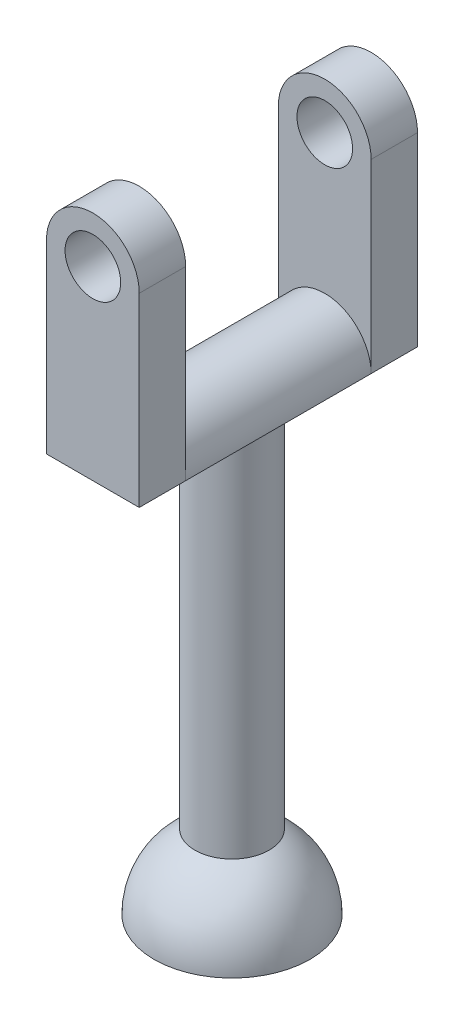
ISO-10303-21;
HEADER;
FILE_DESCRIPTION(('STEP AP214'),'2;1');
FILE_NAME('part.step','',(''),(''),'','','');
FILE_SCHEMA(('AUTOMOTIVE_DESIGN { 1 0 10303 214 1 1 1 1 }'));
ENDSEC;
DATA;
#1=APPLICATION_CONTEXT('core data for automotive mechanical design processes');
#2=APPLICATION_PROTOCOL_DEFINITION('international standard','automotive_design',2000,#1);
#3=PRODUCT_CONTEXT('',#1,'mechanical');
#4=PRODUCT('Part','Part','',(#3));
#5=PRODUCT_RELATED_PRODUCT_CATEGORY('part','',(#4));
#6=PRODUCT_DEFINITION_FORMATION('','',#4);
#7=PRODUCT_DEFINITION_CONTEXT('part definition',#1,'design');
#8=PRODUCT_DEFINITION('design','',#6,#7);
#9=PRODUCT_DEFINITION_SHAPE('','',#8);
#10=(LENGTH_UNIT() NAMED_UNIT(*) SI_UNIT(.MILLI.,.METRE.));
#11=(NAMED_UNIT(*) PLANE_ANGLE_UNIT() SI_UNIT($,.RADIAN.));
#12=(NAMED_UNIT(*) SI_UNIT($,.STERADIAN.) SOLID_ANGLE_UNIT());
#13=UNCERTAINTY_MEASURE_WITH_UNIT(LENGTH_MEASURE(1.E-05),#10,'distance_accuracy_value','');
#14=(GEOMETRIC_REPRESENTATION_CONTEXT(3) GLOBAL_UNCERTAINTY_ASSIGNED_CONTEXT((#13)) GLOBAL_UNIT_ASSIGNED_CONTEXT((#10,
#11,#12)) REPRESENTATION_CONTEXT('',''));
#15=CARTESIAN_POINT('',(0.,0.,0.));
#16=DIRECTION('',(0.,0.,1.));
#17=DIRECTION('',(1.,0.,0.));
#18=AXIS2_PLACEMENT_3D('',#15,#16,#17);
#19=CARTESIAN_POINT('',(6.34999999999999,50.8,19.05));
#20=DIRECTION('',(-1.,0.,0.));
#21=DIRECTION('',(0.,-1.,0.));
#22=AXIS2_PLACEMENT_3D('',#19,#20,#21);
#23=PLANE('',#22);
#24=DIRECTION('',(0.,1.,0.));
#25=VECTOR('',#24,1.);
#26=CARTESIAN_POINT('',(6.34999999999999,50.8,19.05));
#27=LINE('',#26,#25);
#28=CARTESIAN_POINT('',(6.35,19.05,19.05));
#29=VERTEX_POINT('',#28);
#30=CARTESIAN_POINT('',(6.34999999999999,44.45,19.05));
#31=VERTEX_POINT('',#30);
#32=EDGE_CURVE('E155',#29,#31,#27,.T.);
#33=ORIENTED_EDGE('',*,*,#32,.F.);
#34=DIRECTION('',(0.,0.,1.));
#35=VECTOR('',#34,1.);
#36=CARTESIAN_POINT('',(6.35,19.05,19.05));
#37=LINE('',#36,#35);
#38=CARTESIAN_POINT('',(6.35,19.05,12.7));
#39=VERTEX_POINT('',#38);
#40=EDGE_CURVE('E118',#39,#29,#37,.T.);
#41=ORIENTED_EDGE('',*,*,#40,.F.);
#42=DIRECTION('',(0.,1.,0.));
#43=VECTOR('',#42,1.);
#44=CARTESIAN_POINT('',(6.35000000000001,25.4,12.7));
#45=LINE('',#44,#43);
#46=CARTESIAN_POINT('',(6.35000000000001,44.45,12.7));
#47=VERTEX_POINT('',#46);
#48=EDGE_CURVE('E137',#39,#47,#45,.T.);
#49=ORIENTED_EDGE('',*,*,#48,.T.);
#50=DIRECTION('',(0.,0.,-1.));
#51=VECTOR('',#50,1.);
#52=CARTESIAN_POINT('',(6.34999999999999,44.45,19.05));
#53=LINE('',#52,#51);
#54=EDGE_CURVE('E168',#47,#31,#53,.F.);
#55=ORIENTED_EDGE('',*,*,#54,.T.);
#56=EDGE_LOOP('',(#33,#41,#49,#55));
#57=FACE_BOUND('',#56,.T.);
#58=ADVANCED_FACE('F36',(#57),#23,.F.);
#59=CARTESIAN_POINT('',(-6.35000000000001,50.8,19.05));
#60=DIRECTION('',(1.,0.,0.));
#61=DIRECTION('',(0.,1.,0.));
#62=AXIS2_PLACEMENT_3D('',#59,#60,#61);
#63=PLANE('',#62);
#64=DIRECTION('',(0.,-1.,0.));
#65=VECTOR('',#64,1.);
#66=CARTESIAN_POINT('',(-6.35000000000001,50.8,-19.05));
#67=LINE('',#66,#65);
#68=CARTESIAN_POINT('',(-6.35000000000001,44.45,-19.05));
#69=VERTEX_POINT('',#68);
#70=CARTESIAN_POINT('',(-6.35,19.05,-19.05));
#71=VERTEX_POINT('',#70);
#72=EDGE_CURVE('E158',#69,#71,#67,.T.);
#73=ORIENTED_EDGE('',*,*,#72,.T.);
#74=DIRECTION('',(0.,0.,1.));
#75=VECTOR('',#74,1.);
#76=CARTESIAN_POINT('',(-6.35000000000002,19.05,19.05));
#77=LINE('',#76,#75);
#78=CARTESIAN_POINT('',(-6.35000000000002,19.05,-12.7));
#79=VERTEX_POINT('',#78);
#80=EDGE_CURVE('E52',#71,#79,#77,.T.);
#81=ORIENTED_EDGE('',*,*,#80,.T.);
#82=DIRECTION('',(0.,-1.,0.));
#83=VECTOR('',#82,1.);
#84=CARTESIAN_POINT('',(-6.35000000000001,50.8,-12.7));
#85=LINE('',#84,#83);
#86=CARTESIAN_POINT('',(-6.35000000000001,44.45,-12.7));
#87=VERTEX_POINT('',#86);
#88=EDGE_CURVE('E133',#87,#79,#85,.T.);
#89=ORIENTED_EDGE('',*,*,#88,.F.);
#90=DIRECTION('',(0.,0.,-1.));
#91=VECTOR('',#90,1.);
#92=CARTESIAN_POINT('',(-6.35000000000001,44.45,19.05));
#93=LINE('',#92,#91);
#94=EDGE_CURVE('E161',#87,#69,#93,.T.);
#95=ORIENTED_EDGE('',*,*,#94,.T.);
#96=EDGE_LOOP('',(#73,#81,#89,#95));
#97=FACE_BOUND('',#96,.T.);
#98=ADVANCED_FACE('F233',(#97),#63,.F.);
#99=CARTESIAN_POINT('',(0.,19.05,19.05));
#100=DIRECTION('',(0.,0.,1.));
#101=DIRECTION('',(1.,0.,0.));
#102=AXIS2_PLACEMENT_3D('',#99,#100,#101);
#103=CYLINDRICAL_SURFACE('',#102,6.35);
#104=DIRECTION('',(0.,0.,1.));
#105=VECTOR('',#104,1.);
#106=CARTESIAN_POINT('',(-6.35,19.05,19.05));
#107=LINE('',#106,#105);
#108=CARTESIAN_POINT('',(-6.35000000000002,19.05,12.7));
#109=VERTEX_POINT('',#108);
#110=EDGE_CURVE('E177',#109,#79,#107,.F.);
#111=ORIENTED_EDGE('',*,*,#110,.F.);
#112=CARTESIAN_POINT('',(0.,19.05,12.7));
#113=DIRECTION('',(0.,0.,1.));
#114=DIRECTION('',(0.,-1.,0.));
#115=AXIS2_PLACEMENT_3D('',#112,#113,#114);
#116=CIRCLE('',#115,6.35);
#117=EDGE_CURVE('E188',#39,#109,#116,.T.);
#118=ORIENTED_EDGE('',*,*,#117,.F.);
#119=DIRECTION('',(0.,0.,1.));
#120=VECTOR('',#119,1.);
#121=CARTESIAN_POINT('',(6.35,19.05,19.05));
#122=LINE('',#121,#120);
#123=CARTESIAN_POINT('',(6.35,19.05,-12.7));
#124=VERTEX_POINT('',#123);
#125=EDGE_CURVE('E183',#124,#39,#122,.T.);
#126=ORIENTED_EDGE('',*,*,#125,.F.);
#127=CARTESIAN_POINT('',(0.,19.05,-12.7));
#128=DIRECTION('',(0.,0.,-1.));
#129=DIRECTION('',(-1.,0.,0.));
#130=AXIS2_PLACEMENT_3D('',#127,#128,#129);
#131=CIRCLE('',#130,6.35);
#132=EDGE_CURVE('E185',#79,#124,#131,.T.);
#133=ORIENTED_EDGE('',*,*,#132,.F.);
#134=EDGE_LOOP('',(#111,#118,#126,#133));
#135=FACE_BOUND('',#134,.T.);
#136=ADVANCED_FACE('F39',(#135),#103,.T.);
#137=CARTESIAN_POINT('',(0.,44.45,19.05));
#138=DIRECTION('',(0.,0.,-1.));
#139=DIRECTION('',(-1.,0.,0.));
#140=AXIS2_PLACEMENT_3D('',#137,#138,#139);
#141=CYLINDRICAL_SURFACE('',#140,6.35);
#142=CARTESIAN_POINT('',(0.,44.45,12.7));
#143=DIRECTION('',(0.,0.,1.));
#144=DIRECTION('',(0.,-1.,0.));
#145=AXIS2_PLACEMENT_3D('',#142,#143,#144);
#146=CIRCLE('',#145,6.35);
#147=CARTESIAN_POINT('',(-6.35000000000001,44.45,12.7));
#148=VERTEX_POINT('',#147);
#149=EDGE_CURVE('E146',#148,#47,#146,.F.);
#150=ORIENTED_EDGE('',*,*,#149,.F.);
#151=CARTESIAN_POINT('',(-6.35000000000001,44.45,19.05));
#152=VERTEX_POINT('',#151);
#153=EDGE_CURVE('E165',#152,#148,#93,.T.);
#154=ORIENTED_EDGE('',*,*,#153,.F.);
#155=CARTESIAN_POINT('',(0.,44.45,19.05));
#156=DIRECTION('',(0.,0.,1.));
#157=DIRECTION('',(1.,0.,0.));
#158=AXIS2_PLACEMENT_3D('',#155,#156,#157);
#159=CIRCLE('',#158,6.35);
#160=EDGE_CURVE('E172',#31,#152,#159,.T.);
#161=ORIENTED_EDGE('',*,*,#160,.F.);
#162=ORIENTED_EDGE('',*,*,#54,.F.);
#163=EDGE_LOOP('',(#150,#154,#161,#162));
#164=FACE_BOUND('',#163,.T.);
#165=ADVANCED_FACE('F223',(#164),#141,.T.);
#166=CARTESIAN_POINT('',(0.,44.45,-19.05));
#167=DIRECTION('',(0.,0.,1.));
#168=DIRECTION('',(1.,0.,0.));
#169=AXIS2_PLACEMENT_3D('',#166,#167,#168);
#170=CYLINDRICAL_SURFACE('',#169,3.81);
#171=CARTESIAN_POINT('',(0.,44.45,12.7));
#172=DIRECTION('',(0.,0.,1.));
#173=DIRECTION('',(0.,-1.,0.));
#174=AXIS2_PLACEMENT_3D('',#171,#172,#173);
#175=CIRCLE('',#174,3.81);
#176=CARTESIAN_POINT('',(3.81,44.45,12.7));
#177=VERTEX_POINT('',#176);
#178=EDGE_CURVE('E145',#177,#177,#175,.T.);
#179=CARTESIAN_POINT('',(0.,44.45,19.05));
#180=DIRECTION('',(0.,0.,-1.));
#181=DIRECTION('',(1.,0.,0.));
#182=AXIS2_PLACEMENT_3D('',#179,#180,#181);
#183=CIRCLE('',#182,3.81);
#184=CARTESIAN_POINT('',(3.81,44.45,19.05));
#185=VERTEX_POINT('',#184);
#186=EDGE_CURVE('E148',#185,#185,#183,.T.);
#187=CARTESIAN_POINT('',(3.81,44.45,12.7));
#188=CARTESIAN_POINT('',(3.81,44.45,12.7661458333333));
#189=CARTESIAN_POINT('',(3.81,44.45,12.8322916666667));
#190=CARTESIAN_POINT('',(3.81,44.45,12.9645833333333));
#191=CARTESIAN_POINT('',(3.81,44.45,13.0307291666667));
#192=CARTESIAN_POINT('',(3.81,44.45,13.1630208333333));
#193=CARTESIAN_POINT('',(3.81,44.45,13.2291666666667));
#194=CARTESIAN_POINT('',(3.81,44.45,13.3614583333333));
#195=CARTESIAN_POINT('',(3.81,44.45,13.4276041666667));
#196=CARTESIAN_POINT('',(3.81,44.45,13.5598958333333));
#197=CARTESIAN_POINT('',(3.81,44.45,13.6260416666667));
#198=CARTESIAN_POINT('',(3.81,44.45,13.7583333333333));
#199=CARTESIAN_POINT('',(3.81,44.45,13.8244791666667));
#200=CARTESIAN_POINT('',(3.81,44.45,13.9567708333333));
#201=CARTESIAN_POINT('',(3.81,44.45,14.0229166666667));
#202=CARTESIAN_POINT('',(3.81,44.45,14.1552083333333));
#203=CARTESIAN_POINT('',(3.81,44.45,14.2213541666667));
#204=CARTESIAN_POINT('',(3.81,44.45,14.3536458333333));
#205=CARTESIAN_POINT('',(3.81,44.45,14.4197916666667));
#206=CARTESIAN_POINT('',(3.81,44.45,14.5520833333333));
#207=CARTESIAN_POINT('',(3.81,44.45,14.6182291666667));
#208=CARTESIAN_POINT('',(3.81,44.45,14.7505208333333));
#209=CARTESIAN_POINT('',(3.81,44.45,14.8166666666667));
#210=CARTESIAN_POINT('',(3.81,44.45,14.9489583333333));
#211=CARTESIAN_POINT('',(3.81,44.45,15.0151041666667));
#212=CARTESIAN_POINT('',(3.81,44.45,15.1473958333333));
#213=CARTESIAN_POINT('',(3.81,44.45,15.2135416666667));
#214=CARTESIAN_POINT('',(3.81,44.45,15.3458333333333));
#215=CARTESIAN_POINT('',(3.81,44.45,15.4119791666667));
#216=CARTESIAN_POINT('',(3.81,44.45,15.5442708333333));
#217=CARTESIAN_POINT('',(3.81,44.45,15.6104166666667));
#218=CARTESIAN_POINT('',(3.81,44.45,15.7427083333333));
#219=CARTESIAN_POINT('',(3.81,44.45,15.8088541666667));
#220=CARTESIAN_POINT('',(3.81,44.45,15.9411458333333));
#221=CARTESIAN_POINT('',(3.81,44.45,16.0072916666667));
#222=CARTESIAN_POINT('',(3.81,44.45,16.1395833333333));
#223=CARTESIAN_POINT('',(3.81,44.45,16.2057291666667));
#224=CARTESIAN_POINT('',(3.81,44.45,16.3380208333333));
#225=CARTESIAN_POINT('',(3.81,44.45,16.4041666666667));
#226=CARTESIAN_POINT('',(3.81,44.45,16.5364583333333));
#227=CARTESIAN_POINT('',(3.81,44.45,16.6026041666667));
#228=CARTESIAN_POINT('',(3.81,44.45,16.7348958333333));
#229=CARTESIAN_POINT('',(3.81,44.45,16.8010416666667));
#230=CARTESIAN_POINT('',(3.81,44.45,16.9333333333333));
#231=CARTESIAN_POINT('',(3.81,44.45,16.9994791666667));
#232=CARTESIAN_POINT('',(3.81,44.45,17.1317708333333));
#233=CARTESIAN_POINT('',(3.81,44.45,17.1979166666667));
#234=CARTESIAN_POINT('',(3.81,44.45,17.3302083333333));
#235=CARTESIAN_POINT('',(3.81,44.45,17.3963541666667));
#236=CARTESIAN_POINT('',(3.81,44.45,17.5286458333333));
#237=CARTESIAN_POINT('',(3.81,44.45,17.5947916666667));
#238=CARTESIAN_POINT('',(3.81,44.45,17.7270833333333));
#239=CARTESIAN_POINT('',(3.81,44.45,17.7932291666667));
#240=CARTESIAN_POINT('',(3.81,44.45,17.9255208333333));
#241=CARTESIAN_POINT('',(3.81,44.45,17.9916666666667));
#242=CARTESIAN_POINT('',(3.81,44.45,18.1239583333333));
#243=CARTESIAN_POINT('',(3.81,44.45,18.1901041666667));
#244=CARTESIAN_POINT('',(3.81,44.45,18.3223958333333));
#245=CARTESIAN_POINT('',(3.81,44.45,18.3885416666667));
#246=CARTESIAN_POINT('',(3.81,44.45,18.5208333333333));
#247=CARTESIAN_POINT('',(3.81,44.45,18.5869791666667));
#248=CARTESIAN_POINT('',(3.81,44.45,18.7192708333333));
#249=CARTESIAN_POINT('',(3.81,44.45,18.7854166666667));
#250=CARTESIAN_POINT('',(3.81,44.45,18.9177083333333));
#251=CARTESIAN_POINT('',(3.81,44.45,18.9838541666667));
#252=CARTESIAN_POINT('',(3.81,44.45,19.05));
#253=B_SPLINE_CURVE_WITH_KNOTS('',3,(#187,#188,#189,#190,#191,#192,#193,#194,#195,#196,#197,
#198,#199,#200,#201,#202,#203,#204,#205,#206,#207,#208,#209,#210,#211,#212,#213,#214,#215,#216,
#217,#218,#219,#220,#221,#222,#223,#224,#225,#226,#227,#228,#229,#230,#231,#232,#233,#234,#235,
#236,#237,#238,#239,#240,#241,#242,#243,#244,#245,#246,#247,#248,#249,#250,#251,#252),
.UNSPECIFIED.,.F.,.F.,(4,2,2,2,2,2,2,2,2,2,2,2,2,2,2,2,2,2,2,2,2,2,2,2,2,2,2,2,2,2,2,2,4),(0.,
0.198437500000002,0.396874999999998,0.5953125,0.793750000000003,0.992187499999998,1.190625,
1.3890625,1.58750000000001,1.7859375,1.984375,2.18281250000001,2.38125,2.5796875,
2.77812500000001,2.9765625,3.175,3.37343750000001,3.571875,3.7703125,3.96875000000001,4.1671875,
4.365625,4.56406250000001,4.7625,4.96093750000001,5.15937500000001,5.3578125,5.55625000000001,
5.75468750000001,5.95312500000001,6.15156250000001,6.35000000000001),.UNSPECIFIED.);
#254=EDGE_CURVE('BSEAM252',#177,#185,#253,.T.);
#255=ORIENTED_EDGE('',*,*,#178,.F.);
#256=ORIENTED_EDGE('',*,*,#186,.F.);
#257=ORIENTED_EDGE('',*,*,#254,.T.);
#258=ORIENTED_EDGE('',*,*,#254,.F.);
#259=EDGE_LOOP('',(#255,#257,#256,#258));
#260=FACE_BOUND('',#259,.T.);
#261=ADVANCED_FACE('F252',(#260),#170,.F.);
#262=CARTESIAN_POINT('',(0.,44.45,-12.7));
#263=DIRECTION('',(0.,0.,-1.));
#264=DIRECTION('',(-1.,0.,0.));
#265=AXIS2_PLACEMENT_3D('',#262,#263,#264);
#266=CIRCLE('',#265,6.35);
#267=CARTESIAN_POINT('',(6.35000000000001,44.45,-12.7));
#268=VERTEX_POINT('',#267);
#269=EDGE_CURVE('E60',#268,#87,#266,.F.);
#270=ORIENTED_EDGE('',*,*,#269,.F.);
#271=CARTESIAN_POINT('',(6.34999999999999,44.45,-19.05));
#272=VERTEX_POINT('',#271);
#273=EDGE_CURVE('E169',#272,#268,#53,.F.);
#274=ORIENTED_EDGE('',*,*,#273,.F.);
#275=CARTESIAN_POINT('',(0.,44.45,-19.05));
#276=DIRECTION('',(0.,0.,1.));
#277=DIRECTION('',(1.,0.,0.));
#278=AXIS2_PLACEMENT_3D('',#275,#276,#277);
#279=CIRCLE('',#278,6.35);
#280=EDGE_CURVE('E174',#69,#272,#279,.F.);
#281=ORIENTED_EDGE('',*,*,#280,.F.);
#282=ORIENTED_EDGE('',*,*,#94,.F.);
#283=EDGE_LOOP('',(#270,#274,#281,#282));
#284=FACE_BOUND('',#283,.T.);
#285=ADVANCED_FACE('F240',(#284),#141,.T.);
#286=DIRECTION('',(0.,-1.,0.));
#287=VECTOR('',#286,1.);
#288=CARTESIAN_POINT('',(6.35000000000001,50.8,-12.7));
#289=LINE('',#288,#287);
#290=EDGE_CURVE('E134',#268,#124,#289,.T.);
#291=ORIENTED_EDGE('',*,*,#290,.T.);
#292=CARTESIAN_POINT('',(6.35,19.05,-19.05));
#293=VERTEX_POINT('',#292);
#294=EDGE_CURVE('E126',#293,#124,#37,.T.);
#295=ORIENTED_EDGE('',*,*,#294,.F.);
#296=DIRECTION('',(0.,1.,0.));
#297=VECTOR('',#296,1.);
#298=CARTESIAN_POINT('',(6.34999999999999,50.8,-19.05));
#299=LINE('',#298,#297);
#300=EDGE_CURVE('E152',#293,#272,#299,.T.);
#301=ORIENTED_EDGE('',*,*,#300,.T.);
#302=ORIENTED_EDGE('',*,*,#273,.T.);
#303=EDGE_LOOP('',(#291,#295,#301,#302));
#304=FACE_BOUND('',#303,.T.);
#305=ADVANCED_FACE('F204',(#304),#23,.F.);
#306=DIRECTION('',(0.,1.,0.));
#307=VECTOR('',#306,1.);
#308=CARTESIAN_POINT('',(-6.35,25.4,12.7));
#309=LINE('',#308,#307);
#310=EDGE_CURVE('E138',#109,#148,#309,.T.);
#311=ORIENTED_EDGE('',*,*,#310,.F.);
#312=CARTESIAN_POINT('',(-6.35000000000002,19.05,19.05));
#313=VERTEX_POINT('',#312);
#314=EDGE_CURVE('E123',#109,#313,#77,.T.);
#315=ORIENTED_EDGE('',*,*,#314,.T.);
#316=DIRECTION('',(0.,-1.,0.));
#317=VECTOR('',#316,1.);
#318=CARTESIAN_POINT('',(-6.35000000000001,50.8,19.05));
#319=LINE('',#318,#317);
#320=EDGE_CURVE('E157',#152,#313,#319,.T.);
#321=ORIENTED_EDGE('',*,*,#320,.F.);
#322=ORIENTED_EDGE('',*,*,#153,.T.);
#323=EDGE_LOOP('',(#311,#315,#321,#322));
#324=FACE_BOUND('',#323,.T.);
#325=ADVANCED_FACE('F230',(#324),#63,.F.);
#326=CARTESIAN_POINT('',(0.,0.,19.05));
#327=DIRECTION('',(0.,0.,1.));
#328=DIRECTION('',(1.,0.,0.));
#329=AXIS2_PLACEMENT_3D('',#326,#327,#328);
#330=PLANE('',#329);
#331=DIRECTION('',(1.,0.,0.));
#332=VECTOR('',#331,1.);
#333=CARTESIAN_POINT('',(-6.35000000000002,19.05,19.05));
#334=LINE('',#333,#332);
#335=EDGE_CURVE('E128',#313,#29,#334,.T.);
#336=ORIENTED_EDGE('',*,*,#335,.T.);
#337=ORIENTED_EDGE('',*,*,#32,.T.);
#338=ORIENTED_EDGE('',*,*,#160,.T.);
#339=ORIENTED_EDGE('',*,*,#320,.T.);
#340=EDGE_LOOP('',(#336,#337,#338,#339));
#341=FACE_BOUND('',#340,.T.);
#342=ORIENTED_EDGE('',*,*,#186,.T.);
#343=EDGE_LOOP('',(#342));
#344=FACE_BOUND('',#343,.T.);
#345=ADVANCED_FACE('F227',(#341,#344),#330,.T.);
#346=CARTESIAN_POINT('',(0.,0.,-19.05));
#347=DIRECTION('',(0.,0.,1.));
#348=DIRECTION('',(1.,0.,0.));
#349=AXIS2_PLACEMENT_3D('',#346,#347,#348);
#350=PLANE('',#349);
#351=CARTESIAN_POINT('',(0.,44.45,-19.05));
#352=DIRECTION('',(0.,0.,-1.));
#353=DIRECTION('',(1.,0.,0.));
#354=AXIS2_PLACEMENT_3D('',#351,#352,#353);
#355=CIRCLE('',#354,3.81);
#356=CARTESIAN_POINT('',(3.81,44.45,-19.05));
#357=VERTEX_POINT('',#356);
#358=EDGE_CURVE('E149',#357,#357,#355,.T.);
#359=ORIENTED_EDGE('',*,*,#358,.F.);
#360=EDGE_LOOP('',(#359));
#361=FACE_BOUND('',#360,.T.);
#362=ORIENTED_EDGE('',*,*,#300,.F.);
#363=DIRECTION('',(-1.,0.,0.));
#364=VECTOR('',#363,1.);
#365=CARTESIAN_POINT('',(0.,19.05,-19.05));
#366=LINE('',#365,#364);
#367=EDGE_CURVE('E131',#293,#71,#366,.T.);
#368=ORIENTED_EDGE('',*,*,#367,.T.);
#369=ORIENTED_EDGE('',*,*,#72,.F.);
#370=ORIENTED_EDGE('',*,*,#280,.T.);
#371=EDGE_LOOP('',(#362,#368,#369,#370));
#372=FACE_BOUND('',#371,.T.);
#373=ADVANCED_FACE('F238',(#361,#372),#350,.F.);
#374=CARTESIAN_POINT('',(0.,44.45,-12.7));
#375=DIRECTION('',(0.,0.,-1.));
#376=DIRECTION('',(-1.,0.,0.));
#377=AXIS2_PLACEMENT_3D('',#374,#375,#376);
#378=CIRCLE('',#377,3.81);
#379=CARTESIAN_POINT('',(3.81,44.45,-12.7));
#380=VERTEX_POINT('',#379);
#381=EDGE_CURVE('E141',#380,#380,#378,.T.);
#382=CARTESIAN_POINT('',(3.81,44.45,-12.7));
#383=CARTESIAN_POINT('',(3.81,44.45,-12.7661458333333));
#384=CARTESIAN_POINT('',(3.81,44.45,-12.8322916666667));
#385=CARTESIAN_POINT('',(3.81,44.45,-12.9645833333333));
#386=CARTESIAN_POINT('',(3.81,44.45,-13.0307291666667));
#387=CARTESIAN_POINT('',(3.81,44.45,-13.1630208333333));
#388=CARTESIAN_POINT('',(3.81,44.45,-13.2291666666667));
#389=CARTESIAN_POINT('',(3.81,44.45,-13.3614583333333));
#390=CARTESIAN_POINT('',(3.81,44.45,-13.4276041666667));
#391=CARTESIAN_POINT('',(3.81,44.45,-13.5598958333333));
#392=CARTESIAN_POINT('',(3.81,44.45,-13.6260416666667));
#393=CARTESIAN_POINT('',(3.81,44.45,-13.7583333333333));
#394=CARTESIAN_POINT('',(3.81,44.45,-13.8244791666667));
#395=CARTESIAN_POINT('',(3.81,44.45,-13.9567708333333));
#396=CARTESIAN_POINT('',(3.81,44.45,-14.0229166666667));
#397=CARTESIAN_POINT('',(3.81,44.45,-14.1552083333333));
#398=CARTESIAN_POINT('',(3.81,44.45,-14.2213541666667));
#399=CARTESIAN_POINT('',(3.81,44.45,-14.3536458333333));
#400=CARTESIAN_POINT('',(3.81,44.45,-14.4197916666667));
#401=CARTESIAN_POINT('',(3.81,44.45,-14.5520833333333));
#402=CARTESIAN_POINT('',(3.81,44.45,-14.6182291666667));
#403=CARTESIAN_POINT('',(3.81,44.45,-14.7505208333333));
#404=CARTESIAN_POINT('',(3.81,44.45,-14.8166666666667));
#405=CARTESIAN_POINT('',(3.81,44.45,-14.9489583333333));
#406=CARTESIAN_POINT('',(3.81,44.45,-15.0151041666667));
#407=CARTESIAN_POINT('',(3.81,44.45,-15.1473958333333));
#408=CARTESIAN_POINT('',(3.81,44.45,-15.2135416666667));
#409=CARTESIAN_POINT('',(3.81,44.45,-15.3458333333333));
#410=CARTESIAN_POINT('',(3.81,44.45,-15.4119791666667));
#411=CARTESIAN_POINT('',(3.81,44.45,-15.5442708333333));
#412=CARTESIAN_POINT('',(3.81,44.45,-15.6104166666667));
#413=CARTESIAN_POINT('',(3.81,44.45,-15.7427083333333));
#414=CARTESIAN_POINT('',(3.81,44.45,-15.8088541666667));
#415=CARTESIAN_POINT('',(3.81,44.45,-15.9411458333333));
#416=CARTESIAN_POINT('',(3.81,44.45,-16.0072916666667));
#417=CARTESIAN_POINT('',(3.81,44.45,-16.1395833333333));
#418=CARTESIAN_POINT('',(3.81,44.45,-16.2057291666667));
#419=CARTESIAN_POINT('',(3.81,44.45,-16.3380208333333));
#420=CARTESIAN_POINT('',(3.81,44.45,-16.4041666666667));
#421=CARTESIAN_POINT('',(3.81,44.45,-16.5364583333333));
#422=CARTESIAN_POINT('',(3.81,44.45,-16.6026041666667));
#423=CARTESIAN_POINT('',(3.81,44.45,-16.7348958333333));
#424=CARTESIAN_POINT('',(3.81,44.45,-16.8010416666667));
#425=CARTESIAN_POINT('',(3.81,44.45,-16.9333333333333));
#426=CARTESIAN_POINT('',(3.81,44.45,-16.9994791666667));
#427=CARTESIAN_POINT('',(3.81,44.45,-17.1317708333333));
#428=CARTESIAN_POINT('',(3.81,44.45,-17.1979166666667));
#429=CARTESIAN_POINT('',(3.81,44.45,-17.3302083333333));
#430=CARTESIAN_POINT('',(3.81,44.45,-17.3963541666667));
#431=CARTESIAN_POINT('',(3.81,44.45,-17.5286458333333));
#432=CARTESIAN_POINT('',(3.81,44.45,-17.5947916666667));
#433=CARTESIAN_POINT('',(3.81,44.45,-17.7270833333333));
#434=CARTESIAN_POINT('',(3.81,44.45,-17.7932291666667));
#435=CARTESIAN_POINT('',(3.81,44.45,-17.9255208333333));
#436=CARTESIAN_POINT('',(3.81,44.45,-17.9916666666667));
#437=CARTESIAN_POINT('',(3.81,44.45,-18.1239583333333));
#438=CARTESIAN_POINT('',(3.81,44.45,-18.1901041666667));
#439=CARTESIAN_POINT('',(3.81,44.45,-18.3223958333333));
#440=CARTESIAN_POINT('',(3.81,44.45,-18.3885416666667));
#441=CARTESIAN_POINT('',(3.81,44.45,-18.5208333333333));
#442=CARTESIAN_POINT('',(3.81,44.45,-18.5869791666667));
#443=CARTESIAN_POINT('',(3.81,44.45,-18.7192708333333));
#444=CARTESIAN_POINT('',(3.81,44.45,-18.7854166666667));
#445=CARTESIAN_POINT('',(3.81,44.45,-18.9177083333333));
#446=CARTESIAN_POINT('',(3.81,44.45,-18.9838541666667));
#447=CARTESIAN_POINT('',(3.81,44.45,-19.05));
#448=B_SPLINE_CURVE_WITH_KNOTS('',3,(#382,#383,#384,#385,#386,#387,#388,#389,#390,#391,#392,
#393,#394,#395,#396,#397,#398,#399,#400,#401,#402,#403,#404,#405,#406,#407,#408,#409,#410,#411,
#412,#413,#414,#415,#416,#417,#418,#419,#420,#421,#422,#423,#424,#425,#426,#427,#428,#429,#430,
#431,#432,#433,#434,#435,#436,#437,#438,#439,#440,#441,#442,#443,#444,#445,#446,#447),
.UNSPECIFIED.,.F.,.F.,(4,2,2,2,2,2,2,2,2,2,2,2,2,2,2,2,2,2,2,2,2,2,2,2,2,2,2,2,2,2,2,2,4),(0.,
0.198437499999999,0.396874999999998,0.5953125,0.793749999999999,0.992187499999998,1.190625,
1.3890625,1.5875,1.7859375,1.984375,2.1828125,2.38125,2.5796875,2.778125,2.9765625,3.175,
3.3734375,3.571875,3.7703125,3.96875,4.1671875,4.365625,4.5640625,4.7625,4.9609375,5.159375,
5.3578125,5.55625,5.7546875,5.953125,6.1515625,6.35),.UNSPECIFIED.);
#449=EDGE_CURVE('BSEAM259',#380,#357,#448,.T.);
#450=ORIENTED_EDGE('',*,*,#381,.F.);
#451=ORIENTED_EDGE('',*,*,#358,.T.);
#452=ORIENTED_EDGE('',*,*,#449,.T.);
#453=ORIENTED_EDGE('',*,*,#449,.F.);
#454=EDGE_LOOP('',(#450,#452,#451,#453));
#455=FACE_BOUND('',#454,.T.);
#456=ADVANCED_FACE('F259',(#455),#170,.F.);
#457=CARTESIAN_POINT('',(6.35000000000001,25.4,12.7));
#458=DIRECTION('',(0.,0.,1.));
#459=DIRECTION('',(0.,-1.,0.));
#460=AXIS2_PLACEMENT_3D('',#457,#458,#459);
#461=PLANE('',#460);
#462=ORIENTED_EDGE('',*,*,#149,.T.);
#463=ORIENTED_EDGE('',*,*,#48,.F.);
#464=ORIENTED_EDGE('',*,*,#117,.T.);
#465=ORIENTED_EDGE('',*,*,#310,.T.);
#466=EDGE_LOOP('',(#462,#463,#464,#465));
#467=FACE_BOUND('',#466,.T.);
#468=ORIENTED_EDGE('',*,*,#178,.T.);
#469=EDGE_LOOP('',(#468));
#470=FACE_BOUND('',#469,.T.);
#471=ADVANCED_FACE('F213',(#467,#470),#461,.F.);
#472=CARTESIAN_POINT('',(6.35000000000001,50.8,-12.7));
#473=DIRECTION('',(0.,0.,-1.));
#474=DIRECTION('',(-1.,0.,0.));
#475=AXIS2_PLACEMENT_3D('',#472,#473,#474);
#476=PLANE('',#475);
#477=ORIENTED_EDGE('',*,*,#269,.T.);
#478=ORIENTED_EDGE('',*,*,#88,.T.);
#479=ORIENTED_EDGE('',*,*,#132,.T.);
#480=ORIENTED_EDGE('',*,*,#290,.F.);
#481=EDGE_LOOP('',(#477,#478,#479,#480));
#482=FACE_BOUND('',#481,.T.);
#483=ORIENTED_EDGE('',*,*,#381,.T.);
#484=EDGE_LOOP('',(#483));
#485=FACE_BOUND('',#484,.T.);
#486=ADVANCED_FACE('F197',(#482,#485),#476,.F.);
#487=CARTESIAN_POINT('',(-6.35000000000002,19.05,19.05));
#488=DIRECTION('',(0.,1.,0.));
#489=DIRECTION('',(-1.,0.,0.));
#490=AXIS2_PLACEMENT_3D('',#487,#488,#489);
#491=PLANE('',#490);
#492=CARTESIAN_POINT('',(0.,19.05,0.));
#493=DIRECTION('',(0.,1.,0.));
#494=DIRECTION('',(-1.,0.,0.));
#495=AXIS2_PLACEMENT_3D('',#492,#493,#494);
#496=CIRCLE('',#495,5.08);
#497=CARTESIAN_POINT('',(-5.08,19.05,0.));
#498=VERTEX_POINT('',#497);
#499=EDGE_CURVE('E45',#498,#498,#496,.F.);
#500=ORIENTED_EDGE('',*,*,#499,.F.);
#501=EDGE_LOOP('',(#500));
#502=FACE_BOUND('',#501,.T.);
#503=ORIENTED_EDGE('',*,*,#294,.T.);
#504=ORIENTED_EDGE('',*,*,#125,.T.);
#505=ORIENTED_EDGE('',*,*,#40,.T.);
#506=ORIENTED_EDGE('',*,*,#335,.F.);
#507=ORIENTED_EDGE('',*,*,#314,.F.);
#508=ORIENTED_EDGE('',*,*,#110,.T.);
#509=ORIENTED_EDGE('',*,*,#80,.F.);
#510=ORIENTED_EDGE('',*,*,#367,.F.);
#511=EDGE_LOOP('',(#503,#504,#505,#506,#507,#508,#509,#510));
#512=FACE_BOUND('',#511,.T.);
#513=ADVANCED_FACE('F195',(#502,#512),#491,.F.);
#514=CARTESIAN_POINT('',(0.,-31.75,0.));
#515=DIRECTION('',(0.,1.,0.));
#516=DIRECTION('',(-1.,0.,0.));
#517=AXIS2_PLACEMENT_3D('',#514,#515,#516);
#518=CYLINDRICAL_SURFACE('',#517,5.08);
#519=CARTESIAN_POINT('',(0.,-31.75,0.));
#520=DIRECTION('',(0.,-1.,0.));
#521=DIRECTION('',(1.,0.,0.));
#522=AXIS2_PLACEMENT_3D('',#519,#520,#521);
#523=CIRCLE('',#522,5.08);
#524=CARTESIAN_POINT('',(5.08,-31.75,0.));
#525=VERTEX_POINT('',#524);
#526=EDGE_CURVE('E114',#525,#525,#523,.T.);
#527=ORIENTED_EDGE('',*,*,#526,.F.);
#528=EDGE_LOOP('',(#527));
#529=FACE_BOUND('',#528,.T.);
#530=ORIENTED_EDGE('',*,*,#499,.T.);
#531=EDGE_LOOP('',(#530));
#532=FACE_BOUND('',#531,.T.);
#533=ADVANCED_FACE('F193',(#529,#532),#518,.T.);
#534=CARTESIAN_POINT('',(0.,-31.75,0.));
#535=DIRECTION('',(0.,-1.,0.));
#536=DIRECTION('',(1.,0.,0.));
#537=AXIS2_PLACEMENT_3D('',#534,#535,#536);
#538=PLANE('',#537);
#539=CARTESIAN_POINT('',(0.,-31.75,0.));
#540=DIRECTION('',(0.,-1.,0.));
#541=DIRECTION('',(1.,0.,0.));
#542=AXIS2_PLACEMENT_3D('',#539,#540,#541);
#543=CIRCLE('',#542,3.25278711261589);
#544=CARTESIAN_POINT('',(3.25278711261589,-31.75,0.));
#545=VERTEX_POINT('',#544);
#546=EDGE_CURVE('E11',#545,#545,#543,.T.);
#547=ORIENTED_EDGE('',*,*,#546,.F.);
#548=EDGE_LOOP('',(#547));
#549=FACE_BOUND('',#548,.T.);
#550=ORIENTED_EDGE('',*,*,#526,.T.);
#551=EDGE_LOOP('',(#550));
#552=FACE_BOUND('',#551,.T.);
#553=ADVANCED_FACE('F332',(#549,#552),#538,.T.);
#554=CARTESIAN_POINT('',(0.,-41.91,0.));
#555=DIRECTION('',(0.,-1.,0.));
#556=DIRECTION('',(1.,0.,0.));
#557=AXIS2_PLACEMENT_3D('',#554,#555,#556);
#558=SPHERICAL_SURFACE('',#557,10.668);
#559=ORIENTED_EDGE('',*,*,#546,.T.);
#560=EDGE_LOOP('',(#559));
#561=FACE_BOUND('',#560,.T.);
#562=CARTESIAN_POINT('',(0.,-41.91,0.));
#563=DIRECTION('',(0.,-1.,0.));
#564=DIRECTION('',(0.,0.,-1.));
#565=AXIS2_PLACEMENT_3D('',#562,#563,#564);
#566=CIRCLE('',#565,10.668);
#567=CARTESIAN_POINT('',(0.,-41.91,-10.668));
#568=VERTEX_POINT('',#567);
#569=EDGE_CURVE('E115',#568,#568,#566,.T.);
#570=ORIENTED_EDGE('',*,*,#569,.F.);
#571=EDGE_LOOP('',(#570));
#572=FACE_BOUND('',#571,.T.);
#573=ADVANCED_FACE('F108',(#561,#572),#558,.T.);
#574=CARTESIAN_POINT('',(0.,-41.91,0.));
#575=DIRECTION('',(0.,-1.,0.));
#576=DIRECTION('',(1.,0.,0.));
#577=AXIS2_PLACEMENT_3D('',#574,#575,#576);
#578=SPHERICAL_SURFACE('',#577,10.16);
#579=CARTESIAN_POINT('',(0.,-31.75,0.));
#580=VERTEX_POINT('',#579);
#581=VERTEX_LOOP('',#580);
#582=FACE_BOUND('',#581,.T.);
#583=CARTESIAN_POINT('',(0.,-41.91,0.));
#584=DIRECTION('',(0.,-1.,0.));
#585=DIRECTION('',(0.,0.,-1.));
#586=AXIS2_PLACEMENT_3D('',#583,#584,#585);
#587=CIRCLE('',#586,10.16);
#588=CARTESIAN_POINT('',(0.,-41.91,-10.16));
#589=VERTEX_POINT('',#588);
#590=EDGE_CURVE('E112',#589,#589,#587,.T.);
#591=ORIENTED_EDGE('',*,*,#590,.T.);
#592=EDGE_LOOP('',(#591));
#593=FACE_BOUND('',#592,.T.);
#594=ADVANCED_FACE('F104',(#582,#593),#578,.F.);
#595=CARTESIAN_POINT('',(10.668,-41.91,0.));
#596=DIRECTION('',(0.,1.,0.));
#597=DIRECTION('',(0.,0.,1.));
#598=AXIS2_PLACEMENT_3D('',#595,#596,#597);
#599=PLANE('',#598);
#600=ORIENTED_EDGE('',*,*,#590,.F.);
#601=EDGE_LOOP('',(#600));
#602=FACE_BOUND('',#601,.T.);
#603=ORIENTED_EDGE('',*,*,#569,.T.);
#604=EDGE_LOOP('',(#603));
#605=FACE_BOUND('',#604,.T.);
#606=ADVANCED_FACE('F107',(#602,#605),#599,.F.);
#607=CLOSED_SHELL('',(#58,#98,#136,#165,#261,#285,#305,#325,#345,#373,#456,#471,#486,#513,#533,
#553,#573,#594,#606));
#608=MANIFOLD_SOLID_BREP('B2',#607);
#609=ADVANCED_BREP_SHAPE_REPRESENTATION('',(#18,#608),#14);
#610=SHAPE_DEFINITION_REPRESENTATION(#9,#609);
ENDSEC;
END-ISO-10303-21;
